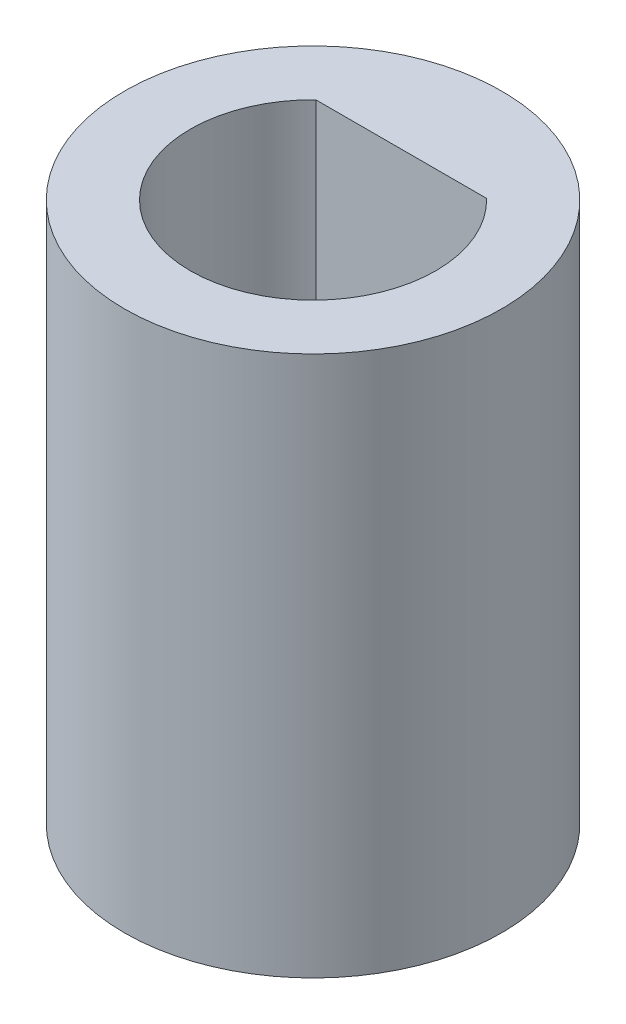
ISO-10303-21;
HEADER;
FILE_DESCRIPTION(('STEP AP214'),'2;1');
FILE_NAME('part.step','',(''),(''),'','','');
FILE_SCHEMA(('AUTOMOTIVE_DESIGN { 1 0 10303 214 1 1 1 1 }'));
ENDSEC;
DATA;
#1=APPLICATION_CONTEXT('core data for automotive mechanical design processes');
#2=APPLICATION_PROTOCOL_DEFINITION('international standard','automotive_design',2000,#1);
#3=PRODUCT_CONTEXT('',#1,'mechanical');
#4=PRODUCT('Part','Part','',(#3));
#5=PRODUCT_RELATED_PRODUCT_CATEGORY('part','',(#4));
#6=PRODUCT_DEFINITION_FORMATION('','',#4);
#7=PRODUCT_DEFINITION_CONTEXT('part definition',#1,'design');
#8=PRODUCT_DEFINITION('design','',#6,#7);
#9=PRODUCT_DEFINITION_SHAPE('','',#8);
#10=(LENGTH_UNIT() NAMED_UNIT(*) SI_UNIT(.MILLI.,.METRE.));
#11=(NAMED_UNIT(*) PLANE_ANGLE_UNIT() SI_UNIT($,.RADIAN.));
#12=(NAMED_UNIT(*) SI_UNIT($,.STERADIAN.) SOLID_ANGLE_UNIT());
#13=UNCERTAINTY_MEASURE_WITH_UNIT(LENGTH_MEASURE(1.E-05),#10,'distance_accuracy_value','');
#14=(GEOMETRIC_REPRESENTATION_CONTEXT(3) GLOBAL_UNCERTAINTY_ASSIGNED_CONTEXT((#13)) GLOBAL_UNIT_ASSIGNED_CONTEXT((#10,
#11,#12)) REPRESENTATION_CONTEXT('',''));
#15=CARTESIAN_POINT('',(0.,0.,0.));
#16=DIRECTION('',(0.,0.,1.));
#17=DIRECTION('',(1.,0.,0.));
#18=AXIS2_PLACEMENT_3D('',#15,#16,#17);
#19=CARTESIAN_POINT('',(0.,-16.4,0.));
#20=DIRECTION('',(0.,1.,0.));
#21=DIRECTION('',(0.,0.,1.));
#22=AXIS2_PLACEMENT_3D('',#19,#20,#21);
#23=CYLINDRICAL_SURFACE('',#22,5.725);
#24=CARTESIAN_POINT('',(0.,-16.4,0.));
#25=DIRECTION('',(0.,1.,0.));
#26=DIRECTION('',(0.,0.,1.));
#27=AXIS2_PLACEMENT_3D('',#24,#25,#26);
#28=CIRCLE('',#27,5.725);
#29=CARTESIAN_POINT('',(0.,-16.4,5.725));
#30=VERTEX_POINT('',#29);
#31=EDGE_CURVE('E11',#30,#30,#28,.T.);
#32=ORIENTED_EDGE('',*,*,#31,.T.);
#33=EDGE_LOOP('',(#32));
#34=FACE_BOUND('',#33,.T.);
#35=CARTESIAN_POINT('',(0.,0.,0.));
#36=DIRECTION('',(0.,1.,0.));
#37=DIRECTION('',(0.,0.,1.));
#38=AXIS2_PLACEMENT_3D('',#35,#36,#37);
#39=CIRCLE('',#38,5.725);
#40=CARTESIAN_POINT('',(0.,0.,5.725));
#41=VERTEX_POINT('',#40);
#42=EDGE_CURVE('E36',#41,#41,#39,.T.);
#43=ORIENTED_EDGE('',*,*,#42,.F.);
#44=EDGE_LOOP('',(#43));
#45=FACE_BOUND('',#44,.T.);
#46=ADVANCED_FACE('F33',(#34,#45),#23,.T.);
#47=CARTESIAN_POINT('',(0.,-16.4,0.));
#48=DIRECTION('',(0.,1.,0.));
#49=DIRECTION('',(0.,0.,1.));
#50=AXIS2_PLACEMENT_3D('',#47,#48,#49);
#51=PLANE('',#50);
#52=DIRECTION('',(-1.,0.,0.));
#53=VECTOR('',#52,1.);
#54=CARTESIAN_POINT('',(-2.59229627936314,-16.4,-2.675));
#55=LINE('',#54,#53);
#56=CARTESIAN_POINT('',(2.59229627936314,-16.4,-2.675));
#57=VERTEX_POINT('',#56);
#58=CARTESIAN_POINT('',(-2.59229627936314,-16.4,-2.675));
#59=VERTEX_POINT('',#58);
#60=EDGE_CURVE('E74',#57,#59,#55,.T.);
#61=ORIENTED_EDGE('',*,*,#60,.T.);
#62=CARTESIAN_POINT('',(0.,-16.4,0.));
#63=DIRECTION('',(0.,1.,0.));
#64=DIRECTION('',(0.,0.,1.));
#65=AXIS2_PLACEMENT_3D('',#62,#63,#64);
#66=CIRCLE('',#65,3.725);
#67=EDGE_CURVE('E47',#59,#57,#66,.T.);
#68=ORIENTED_EDGE('',*,*,#67,.T.);
#69=EDGE_LOOP('',(#61,#68));
#70=FACE_BOUND('',#69,.T.);
#71=ORIENTED_EDGE('',*,*,#31,.F.);
#72=EDGE_LOOP('',(#71));
#73=FACE_BOUND('',#72,.T.);
#74=ADVANCED_FACE('F78',(#70,#73),#51,.F.);
#75=CARTESIAN_POINT('',(0.,0.,0.));
#76=DIRECTION('',(0.,1.,0.));
#77=DIRECTION('',(0.,0.,1.));
#78=AXIS2_PLACEMENT_3D('',#75,#76,#77);
#79=PLANE('',#78);
#80=CARTESIAN_POINT('',(0.,0.,0.));
#81=DIRECTION('',(0.,1.,0.));
#82=DIRECTION('',(0.,0.,1.));
#83=AXIS2_PLACEMENT_3D('',#80,#81,#82);
#84=CIRCLE('',#83,3.725);
#85=CARTESIAN_POINT('',(-2.59229627936314,0.,-2.675));
#86=VERTEX_POINT('',#85);
#87=CARTESIAN_POINT('',(2.59229627936314,0.,-2.675));
#88=VERTEX_POINT('',#87);
#89=EDGE_CURVE('E52',#86,#88,#84,.T.);
#90=ORIENTED_EDGE('',*,*,#89,.F.);
#91=DIRECTION('',(-1.,0.,0.));
#92=VECTOR('',#91,1.);
#93=CARTESIAN_POINT('',(-2.59229627936314,0.,-2.675));
#94=LINE('',#93,#92);
#95=EDGE_CURVE('E66',#88,#86,#94,.T.);
#96=ORIENTED_EDGE('',*,*,#95,.F.);
#97=EDGE_LOOP('',(#90,#96));
#98=FACE_BOUND('',#97,.T.);
#99=ORIENTED_EDGE('',*,*,#42,.T.);
#100=EDGE_LOOP('',(#99));
#101=FACE_BOUND('',#100,.T.);
#102=ADVANCED_FACE('F70',(#98,#101),#79,.T.);
#103=CARTESIAN_POINT('',(0.,-16.4,0.));
#104=DIRECTION('',(0.,1.,0.));
#105=DIRECTION('',(0.,0.,1.));
#106=AXIS2_PLACEMENT_3D('',#103,#104,#105);
#107=CYLINDRICAL_SURFACE('',#106,3.725);
#108=ORIENTED_EDGE('',*,*,#89,.T.);
#109=DIRECTION('',(0.,1.,0.));
#110=VECTOR('',#109,1.);
#111=CARTESIAN_POINT('',(2.59229627936314,-16.4,-2.675));
#112=LINE('',#111,#110);
#113=EDGE_CURVE('E63',#57,#88,#112,.T.);
#114=ORIENTED_EDGE('',*,*,#113,.F.);
#115=ORIENTED_EDGE('',*,*,#67,.F.);
#116=DIRECTION('',(0.,1.,0.));
#117=VECTOR('',#116,1.);
#118=CARTESIAN_POINT('',(-2.59229627936314,-16.4,-2.675));
#119=LINE('',#118,#117);
#120=EDGE_CURVE('E57',#59,#86,#119,.T.);
#121=ORIENTED_EDGE('',*,*,#120,.T.);
#122=EDGE_LOOP('',(#108,#114,#115,#121));
#123=FACE_BOUND('',#122,.T.);
#124=ADVANCED_FACE('F59',(#123),#107,.F.);
#125=CARTESIAN_POINT('',(-2.59229627936314,-16.4,-2.675));
#126=DIRECTION('',(0.,0.,-1.));
#127=DIRECTION('',(-1.,0.,0.));
#128=AXIS2_PLACEMENT_3D('',#125,#126,#127);
#129=PLANE('',#128);
#130=ORIENTED_EDGE('',*,*,#95,.T.);
#131=ORIENTED_EDGE('',*,*,#120,.F.);
#132=ORIENTED_EDGE('',*,*,#60,.F.);
#133=ORIENTED_EDGE('',*,*,#113,.T.);
#134=EDGE_LOOP('',(#130,#131,#132,#133));
#135=FACE_BOUND('',#134,.T.);
#136=ADVANCED_FACE('F67',(#135),#129,.F.);
#137=CLOSED_SHELL('',(#46,#74,#102,#124,#136));
#138=MANIFOLD_SOLID_BREP('B2',#137);
#139=ADVANCED_BREP_SHAPE_REPRESENTATION('',(#18,#138),#14);
#140=SHAPE_DEFINITION_REPRESENTATION(#9,#139);
ENDSEC;
END-ISO-10303-21;
